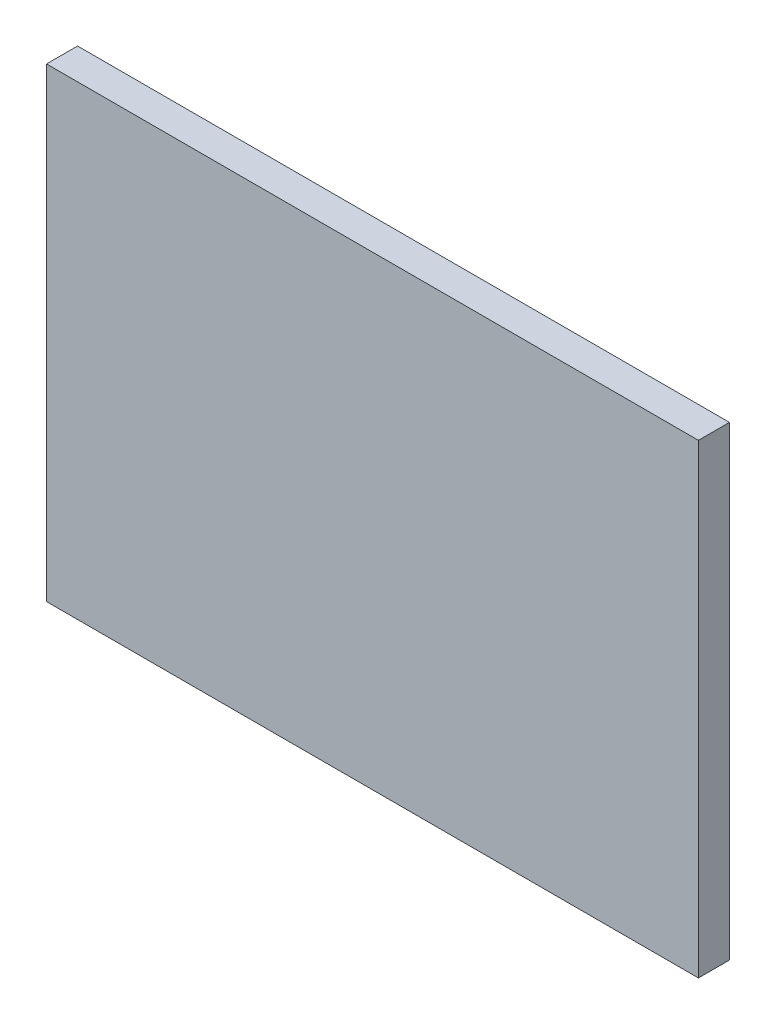
ISO-10303-21;
HEADER;
FILE_DESCRIPTION(('STEP AP214'),'2;1');
FILE_NAME('part.step','',(''),(''),'','','');
FILE_SCHEMA(('AUTOMOTIVE_DESIGN { 1 0 10303 214 1 1 1 1 }'));
ENDSEC;
DATA;
#1=APPLICATION_CONTEXT('core data for automotive mechanical design processes');
#2=APPLICATION_PROTOCOL_DEFINITION('international standard','automotive_design',2000,#1);
#3=PRODUCT_CONTEXT('',#1,'mechanical');
#4=PRODUCT('Part','Part','',(#3));
#5=PRODUCT_RELATED_PRODUCT_CATEGORY('part','',(#4));
#6=PRODUCT_DEFINITION_FORMATION('','',#4);
#7=PRODUCT_DEFINITION_CONTEXT('part definition',#1,'design');
#8=PRODUCT_DEFINITION('design','',#6,#7);
#9=PRODUCT_DEFINITION_SHAPE('','',#8);
#10=(LENGTH_UNIT() NAMED_UNIT(*) SI_UNIT(.MILLI.,.METRE.));
#11=(NAMED_UNIT(*) PLANE_ANGLE_UNIT() SI_UNIT($,.RADIAN.));
#12=(NAMED_UNIT(*) SI_UNIT($,.STERADIAN.) SOLID_ANGLE_UNIT());
#13=UNCERTAINTY_MEASURE_WITH_UNIT(LENGTH_MEASURE(1.E-05),#10,'distance_accuracy_value','');
#14=(GEOMETRIC_REPRESENTATION_CONTEXT(3) GLOBAL_UNCERTAINTY_ASSIGNED_CONTEXT((#13)) GLOBAL_UNIT_ASSIGNED_CONTEXT((#10,
#11,#12)) REPRESENTATION_CONTEXT('',''));
#15=CARTESIAN_POINT('',(0.,0.,0.));
#16=DIRECTION('',(0.,0.,1.));
#17=DIRECTION('',(1.,0.,0.));
#18=AXIS2_PLACEMENT_3D('',#15,#16,#17);
#19=CARTESIAN_POINT('',(-628.,0.,-26.0000000000001));
#20=DIRECTION('',(1.,0.,0.));
#21=DIRECTION('',(0.,0.,-1.));
#22=AXIS2_PLACEMENT_3D('',#19,#20,#21);
#23=PLANE('',#22);
#24=DIRECTION('',(0.,0.,-1.));
#25=VECTOR('',#24,1.);
#26=CARTESIAN_POINT('',(-628.,-30.,150.));
#27=LINE('',#26,#25);
#28=CARTESIAN_POINT('',(-628.,-30.,146.));
#29=VERTEX_POINT('',#28);
#30=CARTESIAN_POINT('',(-628.,-30.,144.));
#31=VERTEX_POINT('',#30);
#32=EDGE_CURVE('E86',#29,#31,#27,.T.);
#33=ORIENTED_EDGE('',*,*,#32,.F.);
#34=DIRECTION('',(0.,1.,0.));
#35=VECTOR('',#34,1.);
#36=CARTESIAN_POINT('',(-628.,0.,146.));
#37=LINE('',#36,#35);
#38=CARTESIAN_POINT('',(-628.,0.,146.));
#39=VERTEX_POINT('',#38);
#40=EDGE_CURVE('E43',#29,#39,#37,.T.);
#41=ORIENTED_EDGE('',*,*,#40,.T.);
#42=DIRECTION('',(0.,0.,1.));
#43=VECTOR('',#42,1.);
#44=CARTESIAN_POINT('',(-628.,0.,-107.999999999999));
#45=LINE('',#44,#43);
#46=CARTESIAN_POINT('',(-628.,0.,144.));
#47=VERTEX_POINT('',#46);
#48=EDGE_CURVE('E77',#47,#39,#45,.T.);
#49=ORIENTED_EDGE('',*,*,#48,.F.);
#50=DIRECTION('',(0.,1.,0.));
#51=VECTOR('',#50,1.);
#52=CARTESIAN_POINT('',(-628.,-30.,144.));
#53=LINE('',#52,#51);
#54=EDGE_CURVE('E88',#31,#47,#53,.T.);
#55=ORIENTED_EDGE('',*,*,#54,.F.);
#56=EDGE_LOOP('',(#33,#41,#49,#55));
#57=FACE_BOUND('',#56,.T.);
#58=ADVANCED_FACE('F40',(#57),#23,.F.);
#59=CARTESIAN_POINT('',(-586.,0.,0.));
#60=DIRECTION('',(1.,0.,0.));
#61=DIRECTION('',(0.,0.,-1.));
#62=AXIS2_PLACEMENT_3D('',#59,#60,#61);
#63=PLANE('',#62);
#64=DIRECTION('',(0.,0.,-1.));
#65=VECTOR('',#64,1.);
#66=CARTESIAN_POINT('',(-586.,0.,0.));
#67=LINE('',#66,#65);
#68=CARTESIAN_POINT('',(-586.,0.,146.));
#69=VERTEX_POINT('',#68);
#70=CARTESIAN_POINT('',(-586.,0.,144.));
#71=VERTEX_POINT('',#70);
#72=EDGE_CURVE('E58',#69,#71,#67,.T.);
#73=ORIENTED_EDGE('',*,*,#72,.F.);
#74=DIRECTION('',(0.,-1.,0.));
#75=VECTOR('',#74,1.);
#76=CARTESIAN_POINT('',(-586.,0.,146.));
#77=LINE('',#76,#75);
#78=CARTESIAN_POINT('',(-586.,-30.,146.));
#79=VERTEX_POINT('',#78);
#80=EDGE_CURVE('E96',#69,#79,#77,.T.);
#81=ORIENTED_EDGE('',*,*,#80,.T.);
#82=DIRECTION('',(0.,0.,-1.));
#83=VECTOR('',#82,1.);
#84=CARTESIAN_POINT('',(-586.,-30.,180.));
#85=LINE('',#84,#83);
#86=CARTESIAN_POINT('',(-586.,-30.,144.));
#87=VERTEX_POINT('',#86);
#88=EDGE_CURVE('E95',#79,#87,#85,.T.);
#89=ORIENTED_EDGE('',*,*,#88,.T.);
#90=DIRECTION('',(0.,1.,0.));
#91=VECTOR('',#90,1.);
#92=CARTESIAN_POINT('',(-586.,-30.,144.));
#93=LINE('',#92,#91);
#94=EDGE_CURVE('E106',#87,#71,#93,.T.);
#95=ORIENTED_EDGE('',*,*,#94,.T.);
#96=EDGE_LOOP('',(#73,#81,#89,#95));
#97=FACE_BOUND('',#96,.T.);
#98=ADVANCED_FACE('F112',(#97),#63,.T.);
#99=CARTESIAN_POINT('',(-588.,0.,146.));
#100=DIRECTION('',(0.,0.,1.));
#101=DIRECTION('',(1.,0.,0.));
#102=AXIS2_PLACEMENT_3D('',#99,#100,#101);
#103=PLANE('',#102);
#104=ORIENTED_EDGE('',*,*,#40,.F.);
#105=DIRECTION('',(1.,0.,0.));
#106=VECTOR('',#105,1.);
#107=CARTESIAN_POINT('',(-628.,-30.,146.));
#108=LINE('',#107,#106);
#109=EDGE_CURVE('E49',#29,#79,#108,.T.);
#110=ORIENTED_EDGE('',*,*,#109,.T.);
#111=ORIENTED_EDGE('',*,*,#80,.F.);
#112=DIRECTION('',(-1.,0.,0.));
#113=VECTOR('',#112,1.);
#114=CARTESIAN_POINT('',(708.,0.,146.));
#115=LINE('',#114,#113);
#116=EDGE_CURVE('E11',#69,#39,#115,.T.);
#117=ORIENTED_EDGE('',*,*,#116,.T.);
#118=EDGE_LOOP('',(#104,#110,#111,#117));
#119=FACE_BOUND('',#118,.T.);
#120=ADVANCED_FACE('F82',(#119),#103,.T.);
#121=CARTESIAN_POINT('',(0.,0.,144.));
#122=DIRECTION('',(0.,0.,1.));
#123=DIRECTION('',(1.,0.,0.));
#124=AXIS2_PLACEMENT_3D('',#121,#122,#123);
#125=PLANE('',#124);
#126=ORIENTED_EDGE('',*,*,#54,.T.);
#127=DIRECTION('',(1.,0.,0.));
#128=VECTOR('',#127,1.);
#129=CARTESIAN_POINT('',(0.,0.,144.));
#130=LINE('',#129,#128);
#131=EDGE_CURVE('E98',#47,#71,#130,.T.);
#132=ORIENTED_EDGE('',*,*,#131,.T.);
#133=ORIENTED_EDGE('',*,*,#94,.F.);
#134=DIRECTION('',(-1.,0.,0.));
#135=VECTOR('',#134,1.);
#136=CARTESIAN_POINT('',(-588.,-30.,144.));
#137=LINE('',#136,#135);
#138=EDGE_CURVE('E103',#87,#31,#137,.T.);
#139=ORIENTED_EDGE('',*,*,#138,.T.);
#140=EDGE_LOOP('',(#126,#132,#133,#139));
#141=FACE_BOUND('',#140,.T.);
#142=ADVANCED_FACE('F111',(#141),#125,.F.);
#143=CARTESIAN_POINT('',(708.,0.,-108.));
#144=DIRECTION('',(0.,-1.,0.));
#145=DIRECTION('',(0.,0.,-1.));
#146=AXIS2_PLACEMENT_3D('',#143,#144,#145);
#147=PLANE('',#146);
#148=ORIENTED_EDGE('',*,*,#131,.F.);
#149=ORIENTED_EDGE('',*,*,#48,.T.);
#150=ORIENTED_EDGE('',*,*,#116,.F.);
#151=ORIENTED_EDGE('',*,*,#72,.T.);
#152=EDGE_LOOP('',(#148,#149,#150,#151));
#153=FACE_BOUND('',#152,.T.);
#154=ADVANCED_FACE('F122',(#153),#147,.F.);
#155=CARTESIAN_POINT('',(-628.,-30.,150.));
#156=DIRECTION('',(0.,1.,0.));
#157=DIRECTION('',(0.,0.,1.));
#158=AXIS2_PLACEMENT_3D('',#155,#156,#157);
#159=PLANE('',#158);
#160=ORIENTED_EDGE('',*,*,#109,.F.);
#161=ORIENTED_EDGE('',*,*,#32,.T.);
#162=ORIENTED_EDGE('',*,*,#138,.F.);
#163=ORIENTED_EDGE('',*,*,#88,.F.);
#164=EDGE_LOOP('',(#160,#161,#162,#163));
#165=FACE_BOUND('',#164,.T.);
#166=ADVANCED_FACE('F93',(#165),#159,.F.);
#167=CLOSED_SHELL('',(#58,#98,#120,#142,#154,#166));
#168=MANIFOLD_SOLID_BREP('B2',#167);
#169=ADVANCED_BREP_SHAPE_REPRESENTATION('',(#18,#168),#14);
#170=SHAPE_DEFINITION_REPRESENTATION(#9,#169);
ENDSEC;
END-ISO-10303-21;
